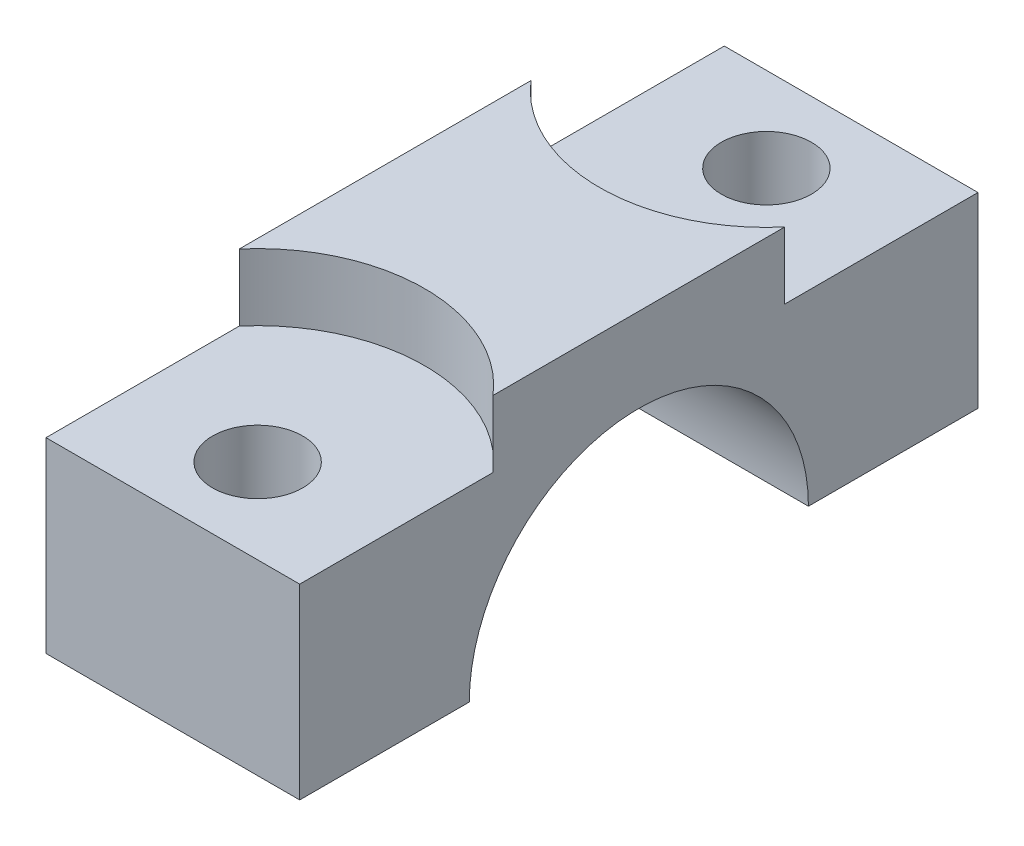
ISO-10303-21;
HEADER;
FILE_DESCRIPTION(('STEP AP214'),'2;1');
FILE_NAME('part.step','',(''),(''),'','','');
FILE_SCHEMA(('AUTOMOTIVE_DESIGN { 1 0 10303 214 1 1 1 1 }'));
ENDSEC;
DATA;
#1=APPLICATION_CONTEXT('core data for automotive mechanical design processes');
#2=APPLICATION_PROTOCOL_DEFINITION('international standard','automotive_design',2000,#1);
#3=PRODUCT_CONTEXT('',#1,'mechanical');
#4=PRODUCT('Part','Part','',(#3));
#5=PRODUCT_RELATED_PRODUCT_CATEGORY('part','',(#4));
#6=PRODUCT_DEFINITION_FORMATION('','',#4);
#7=PRODUCT_DEFINITION_CONTEXT('part definition',#1,'design');
#8=PRODUCT_DEFINITION('design','',#6,#7);
#9=PRODUCT_DEFINITION_SHAPE('','',#8);
#10=(LENGTH_UNIT() NAMED_UNIT(*) SI_UNIT(.MILLI.,.METRE.));
#11=(NAMED_UNIT(*) PLANE_ANGLE_UNIT() SI_UNIT($,.RADIAN.));
#12=(NAMED_UNIT(*) SI_UNIT($,.STERADIAN.) SOLID_ANGLE_UNIT());
#13=UNCERTAINTY_MEASURE_WITH_UNIT(LENGTH_MEASURE(1.E-05),#10,'distance_accuracy_value','');
#14=(GEOMETRIC_REPRESENTATION_CONTEXT(3) GLOBAL_UNCERTAINTY_ASSIGNED_CONTEXT((#13)) GLOBAL_UNIT_ASSIGNED_CONTEXT((#10,
#11,#12)) REPRESENTATION_CONTEXT('',''));
#15=CARTESIAN_POINT('',(0.,0.,0.));
#16=DIRECTION('',(0.,0.,1.));
#17=DIRECTION('',(1.,0.,0.));
#18=AXIS2_PLACEMENT_3D('',#15,#16,#17);
#19=CARTESIAN_POINT('',(9.5,0.,0.));
#20=DIRECTION('',(-1.,0.,0.));
#21=DIRECTION('',(0.,0.,1.));
#22=AXIS2_PLACEMENT_3D('',#19,#20,#21);
#23=CYLINDRICAL_SURFACE('',#22,12.7);
#24=CARTESIAN_POINT('',(-9.5,0.,0.));
#25=DIRECTION('',(1.,0.,0.));
#26=DIRECTION('',(0.,0.,-1.));
#27=AXIS2_PLACEMENT_3D('',#24,#25,#26);
#28=CIRCLE('',#27,12.7);
#29=CARTESIAN_POINT('',(-9.5,0.,-12.7));
#30=VERTEX_POINT('',#29);
#31=CARTESIAN_POINT('',(-9.5,0.,12.7));
#32=VERTEX_POINT('',#31);
#33=EDGE_CURVE('E147',#30,#32,#28,.T.);
#34=ORIENTED_EDGE('',*,*,#33,.F.);
#35=DIRECTION('',(-1.,0.,0.));
#36=VECTOR('',#35,1.);
#37=CARTESIAN_POINT('',(9.5,0.,-12.7));
#38=LINE('',#37,#36);
#39=CARTESIAN_POINT('',(9.5,0.,-12.7));
#40=VERTEX_POINT('',#39);
#41=EDGE_CURVE('E180',#40,#30,#38,.T.);
#42=ORIENTED_EDGE('',*,*,#41,.F.);
#43=CARTESIAN_POINT('',(9.5,0.,0.));
#44=DIRECTION('',(1.,0.,0.));
#45=DIRECTION('',(0.,0.,-1.));
#46=AXIS2_PLACEMENT_3D('',#43,#44,#45);
#47=CIRCLE('',#46,12.7);
#48=CARTESIAN_POINT('',(9.5,0.,12.7));
#49=VERTEX_POINT('',#48);
#50=EDGE_CURVE('E148',#40,#49,#47,.T.);
#51=ORIENTED_EDGE('',*,*,#50,.T.);
#52=DIRECTION('',(-1.,0.,0.));
#53=VECTOR('',#52,1.);
#54=CARTESIAN_POINT('',(9.5,0.,12.7));
#55=LINE('',#54,#53);
#56=EDGE_CURVE('E172',#49,#32,#55,.T.);
#57=ORIENTED_EDGE('',*,*,#56,.T.);
#58=EDGE_LOOP('',(#34,#42,#51,#57));
#59=FACE_BOUND('',#58,.T.);
#60=ADVANCED_FACE('F34',(#59),#23,.F.);
#61=CARTESIAN_POINT('',(9.5,0.,0.));
#62=DIRECTION('',(0.,1.,0.));
#63=DIRECTION('',(0.,0.,1.));
#64=AXIS2_PLACEMENT_3D('',#61,#62,#63);
#65=PLANE('',#64);
#66=CARTESIAN_POINT('',(0.,0.,-19.05));
#67=DIRECTION('',(0.,1.,0.));
#68=DIRECTION('',(0.,0.,1.));
#69=AXIS2_PLACEMENT_3D('',#66,#67,#68);
#70=CIRCLE('',#69,3.37499999999999);
#71=CARTESIAN_POINT('',(0.,0.,-15.675));
#72=VERTEX_POINT('',#71);
#73=EDGE_CURVE('E140',#72,#72,#70,.T.);
#74=ORIENTED_EDGE('',*,*,#73,.T.);
#75=EDGE_LOOP('',(#74));
#76=FACE_BOUND('',#75,.T.);
#77=DIRECTION('',(0.,0.,-1.));
#78=VECTOR('',#77,1.);
#79=CARTESIAN_POINT('',(-9.5,0.,0.));
#80=LINE('',#79,#78);
#81=CARTESIAN_POINT('',(-9.5,0.,-25.4));
#82=VERTEX_POINT('',#81);
#83=EDGE_CURVE('E163',#30,#82,#80,.T.);
#84=ORIENTED_EDGE('',*,*,#83,.T.);
#85=DIRECTION('',(-1.,0.,0.));
#86=VECTOR('',#85,1.);
#87=CARTESIAN_POINT('',(9.5,0.,-25.4));
#88=LINE('',#87,#86);
#89=CARTESIAN_POINT('',(9.5,0.,-25.4));
#90=VERTEX_POINT('',#89);
#91=EDGE_CURVE('E177',#90,#82,#88,.T.);
#92=ORIENTED_EDGE('',*,*,#91,.F.);
#93=DIRECTION('',(0.,0.,-1.));
#94=VECTOR('',#93,1.);
#95=CARTESIAN_POINT('',(9.5,0.,0.));
#96=LINE('',#95,#94);
#97=EDGE_CURVE('E151',#40,#90,#96,.T.);
#98=ORIENTED_EDGE('',*,*,#97,.F.);
#99=ORIENTED_EDGE('',*,*,#41,.T.);
#100=EDGE_LOOP('',(#84,#92,#98,#99));
#101=FACE_BOUND('',#100,.T.);
#102=ADVANCED_FACE('F228',(#76,#101),#65,.F.);
#103=CARTESIAN_POINT('',(9.5,0.,-25.4));
#104=DIRECTION('',(0.,0.,-1.));
#105=DIRECTION('',(0.,1.,0.));
#106=AXIS2_PLACEMENT_3D('',#103,#104,#105);
#107=PLANE('',#106);
#108=DIRECTION('',(-1.,0.,0.));
#109=VECTOR('',#108,1.);
#110=CARTESIAN_POINT('',(9.5,14.,-25.4));
#111=LINE('',#110,#109);
#112=CARTESIAN_POINT('',(9.5,14.,-25.4));
#113=VERTEX_POINT('',#112);
#114=CARTESIAN_POINT('',(-9.5,14.,-25.4));
#115=VERTEX_POINT('',#114);
#116=EDGE_CURVE('E145',#113,#115,#111,.T.);
#117=ORIENTED_EDGE('',*,*,#116,.F.);
#118=DIRECTION('',(0.,-1.,0.));
#119=VECTOR('',#118,1.);
#120=CARTESIAN_POINT('',(9.5,0.,-25.4));
#121=LINE('',#120,#119);
#122=EDGE_CURVE('E155',#113,#90,#121,.T.);
#123=ORIENTED_EDGE('',*,*,#122,.T.);
#124=ORIENTED_EDGE('',*,*,#91,.T.);
#125=DIRECTION('',(0.,-1.,0.));
#126=VECTOR('',#125,1.);
#127=CARTESIAN_POINT('',(-9.5,0.,-25.4));
#128=LINE('',#127,#126);
#129=EDGE_CURVE('E166',#115,#82,#128,.T.);
#130=ORIENTED_EDGE('',*,*,#129,.F.);
#131=EDGE_LOOP('',(#117,#123,#124,#130));
#132=FACE_BOUND('',#131,.T.);
#133=ADVANCED_FACE('F215',(#132),#107,.T.);
#134=CARTESIAN_POINT('',(9.5,19.,0.));
#135=DIRECTION('',(0.,1.,0.));
#136=DIRECTION('',(0.,0.,1.));
#137=AXIS2_PLACEMENT_3D('',#134,#135,#136);
#138=PLANE('',#137);
#139=CARTESIAN_POINT('',(0.,19.,19.05));
#140=DIRECTION('',(0.,1.,0.));
#141=DIRECTION('',(0.,0.,1.));
#142=AXIS2_PLACEMENT_3D('',#139,#140,#141);
#143=CIRCLE('',#142,12.5);
#144=CARTESIAN_POINT('',(9.5,19.,10.925961595364));
#145=VERTEX_POINT('',#144);
#146=CARTESIAN_POINT('',(-9.5,19.,10.925961595364));
#147=VERTEX_POINT('',#146);
#148=EDGE_CURVE('E124',#145,#147,#143,.T.);
#149=ORIENTED_EDGE('',*,*,#148,.F.);
#150=DIRECTION('',(0.,0.,-1.));
#151=VECTOR('',#150,1.);
#152=CARTESIAN_POINT('',(9.5,19.,0.));
#153=LINE('',#152,#151);
#154=CARTESIAN_POINT('',(9.5,19.,-10.925961595364));
#155=VERTEX_POINT('',#154);
#156=EDGE_CURVE('E129',#145,#155,#153,.T.);
#157=ORIENTED_EDGE('',*,*,#156,.T.);
#158=CARTESIAN_POINT('',(0.,19.,-19.05));
#159=DIRECTION('',(0.,1.,0.));
#160=DIRECTION('',(0.,0.,1.));
#161=AXIS2_PLACEMENT_3D('',#158,#159,#160);
#162=CIRCLE('',#161,12.5);
#163=CARTESIAN_POINT('',(-9.5,19.,-10.925961595364));
#164=VERTEX_POINT('',#163);
#165=EDGE_CURVE('E130',#164,#155,#162,.T.);
#166=ORIENTED_EDGE('',*,*,#165,.F.);
#167=DIRECTION('',(0.,0.,-1.));
#168=VECTOR('',#167,1.);
#169=CARTESIAN_POINT('',(-9.5,19.,0.));
#170=LINE('',#169,#168);
#171=EDGE_CURVE('E168',#147,#164,#170,.T.);
#172=ORIENTED_EDGE('',*,*,#171,.F.);
#173=EDGE_LOOP('',(#149,#157,#166,#172));
#174=FACE_BOUND('',#173,.T.);
#175=ADVANCED_FACE('F204',(#174),#138,.T.);
#176=CARTESIAN_POINT('',(9.5,0.,25.4));
#177=DIRECTION('',(0.,0.,-1.));
#178=DIRECTION('',(-1.,0.,0.));
#179=AXIS2_PLACEMENT_3D('',#176,#177,#178);
#180=PLANE('',#179);
#181=DIRECTION('',(0.,-1.,0.));
#182=VECTOR('',#181,1.);
#183=CARTESIAN_POINT('',(9.5,0.,25.4));
#184=LINE('',#183,#182);
#185=CARTESIAN_POINT('',(9.5,14.,25.4));
#186=VERTEX_POINT('',#185);
#187=CARTESIAN_POINT('',(9.5,0.,25.4));
#188=VERTEX_POINT('',#187);
#189=EDGE_CURVE('E159',#186,#188,#184,.T.);
#190=ORIENTED_EDGE('',*,*,#189,.F.);
#191=DIRECTION('',(-1.,0.,0.));
#192=VECTOR('',#191,1.);
#193=CARTESIAN_POINT('',(9.5,14.,25.4));
#194=LINE('',#193,#192);
#195=CARTESIAN_POINT('',(-9.5,14.,25.4));
#196=VERTEX_POINT('',#195);
#197=EDGE_CURVE('E113',#186,#196,#194,.T.);
#198=ORIENTED_EDGE('',*,*,#197,.T.);
#199=DIRECTION('',(0.,-1.,0.));
#200=VECTOR('',#199,1.);
#201=CARTESIAN_POINT('',(-9.5,0.,25.4));
#202=LINE('',#201,#200);
#203=CARTESIAN_POINT('',(-9.5,0.,25.4));
#204=VERTEX_POINT('',#203);
#205=EDGE_CURVE('E170',#196,#204,#202,.T.);
#206=ORIENTED_EDGE('',*,*,#205,.T.);
#207=DIRECTION('',(-1.,0.,0.));
#208=VECTOR('',#207,1.);
#209=CARTESIAN_POINT('',(9.5,0.,25.4));
#210=LINE('',#209,#208);
#211=EDGE_CURVE('E174',#188,#204,#210,.T.);
#212=ORIENTED_EDGE('',*,*,#211,.F.);
#213=EDGE_LOOP('',(#190,#198,#206,#212));
#214=FACE_BOUND('',#213,.T.);
#215=ADVANCED_FACE('F195',(#214),#180,.F.);
#216=CARTESIAN_POINT('',(0.,0.,19.05));
#217=DIRECTION('',(0.,1.,0.));
#218=DIRECTION('',(0.,0.,1.));
#219=AXIS2_PLACEMENT_3D('',#216,#217,#218);
#220=CIRCLE('',#219,3.37499999999999);
#221=CARTESIAN_POINT('',(0.,0.,22.425));
#222=VERTEX_POINT('',#221);
#223=EDGE_CURVE('E197',#222,#222,#220,.T.);
#224=ORIENTED_EDGE('',*,*,#223,.T.);
#225=EDGE_LOOP('',(#224));
#226=FACE_BOUND('',#225,.T.);
#227=EDGE_CURVE('E152',#204,#32,#80,.T.);
#228=ORIENTED_EDGE('',*,*,#227,.T.);
#229=ORIENTED_EDGE('',*,*,#56,.F.);
#230=EDGE_CURVE('E156',#188,#49,#96,.T.);
#231=ORIENTED_EDGE('',*,*,#230,.F.);
#232=ORIENTED_EDGE('',*,*,#211,.T.);
#233=EDGE_LOOP('',(#228,#229,#231,#232));
#234=FACE_BOUND('',#233,.T.);
#235=ADVANCED_FACE('F227',(#226,#234),#65,.F.);
#236=CARTESIAN_POINT('',(9.5,0.,0.));
#237=DIRECTION('',(1.,0.,0.));
#238=DIRECTION('',(0.,0.,-1.));
#239=AXIS2_PLACEMENT_3D('',#236,#237,#238);
#240=PLANE('',#239);
#241=DIRECTION('',(0.,1.,0.));
#242=VECTOR('',#241,1.);
#243=CARTESIAN_POINT('',(9.5,19.,10.925961595364));
#244=LINE('',#243,#242);
#245=CARTESIAN_POINT('',(9.5,14.,10.925961595364));
#246=VERTEX_POINT('',#245);
#247=EDGE_CURVE('E117',#246,#145,#244,.T.);
#248=ORIENTED_EDGE('',*,*,#247,.F.);
#249=DIRECTION('',(0.,0.,-1.));
#250=VECTOR('',#249,1.);
#251=CARTESIAN_POINT('',(9.5,14.,0.));
#252=LINE('',#251,#250);
#253=EDGE_CURVE('E109',#186,#246,#252,.T.);
#254=ORIENTED_EDGE('',*,*,#253,.F.);
#255=ORIENTED_EDGE('',*,*,#189,.T.);
#256=ORIENTED_EDGE('',*,*,#230,.T.);
#257=ORIENTED_EDGE('',*,*,#50,.F.);
#258=ORIENTED_EDGE('',*,*,#97,.T.);
#259=ORIENTED_EDGE('',*,*,#122,.F.);
#260=DIRECTION('',(0.,0.,-1.));
#261=VECTOR('',#260,1.);
#262=CARTESIAN_POINT('',(9.5,14.,0.));
#263=LINE('',#262,#261);
#264=CARTESIAN_POINT('',(9.5,14.,-10.925961595364));
#265=VERTEX_POINT('',#264);
#266=EDGE_CURVE('E188',#265,#113,#263,.T.);
#267=ORIENTED_EDGE('',*,*,#266,.F.);
#268=DIRECTION('',(0.,1.,0.));
#269=VECTOR('',#268,1.);
#270=CARTESIAN_POINT('',(9.5,19.,-10.925961595364));
#271=LINE('',#270,#269);
#272=EDGE_CURVE('E143',#155,#265,#271,.F.);
#273=ORIENTED_EDGE('',*,*,#272,.F.);
#274=ORIENTED_EDGE('',*,*,#156,.F.);
#275=EDGE_LOOP('',(#248,#254,#255,#256,#257,#258,#259,#267,#273,#274));
#276=FACE_BOUND('',#275,.T.);
#277=ADVANCED_FACE('F127',(#276),#240,.T.);
#278=CARTESIAN_POINT('',(-9.5,0.,0.));
#279=DIRECTION('',(1.,0.,0.));
#280=DIRECTION('',(0.,0.,-1.));
#281=AXIS2_PLACEMENT_3D('',#278,#279,#280);
#282=PLANE('',#281);
#283=DIRECTION('',(0.,0.,-1.));
#284=VECTOR('',#283,1.);
#285=CARTESIAN_POINT('',(-9.5,14.,0.));
#286=LINE('',#285,#284);
#287=CARTESIAN_POINT('',(-9.5,14.,10.925961595364));
#288=VERTEX_POINT('',#287);
#289=EDGE_CURVE('E41',#196,#288,#286,.T.);
#290=ORIENTED_EDGE('',*,*,#289,.T.);
#291=DIRECTION('',(0.,1.,0.));
#292=VECTOR('',#291,1.);
#293=CARTESIAN_POINT('',(-9.5,19.,10.925961595364));
#294=LINE('',#293,#292);
#295=EDGE_CURVE('E11',#288,#147,#294,.T.);
#296=ORIENTED_EDGE('',*,*,#295,.T.);
#297=ORIENTED_EDGE('',*,*,#171,.T.);
#298=DIRECTION('',(0.,1.,0.));
#299=VECTOR('',#298,1.);
#300=CARTESIAN_POINT('',(-9.5,19.,-10.925961595364));
#301=LINE('',#300,#299);
#302=CARTESIAN_POINT('',(-9.5,14.,-10.925961595364));
#303=VERTEX_POINT('',#302);
#304=EDGE_CURVE('E182',#164,#303,#301,.F.);
#305=ORIENTED_EDGE('',*,*,#304,.T.);
#306=DIRECTION('',(0.,0.,-1.));
#307=VECTOR('',#306,1.);
#308=CARTESIAN_POINT('',(-9.5,14.,0.));
#309=LINE('',#308,#307);
#310=EDGE_CURVE('E185',#303,#115,#309,.T.);
#311=ORIENTED_EDGE('',*,*,#310,.T.);
#312=ORIENTED_EDGE('',*,*,#129,.T.);
#313=ORIENTED_EDGE('',*,*,#83,.F.);
#314=ORIENTED_EDGE('',*,*,#33,.T.);
#315=ORIENTED_EDGE('',*,*,#227,.F.);
#316=ORIENTED_EDGE('',*,*,#205,.F.);
#317=EDGE_LOOP('',(#290,#296,#297,#305,#311,#312,#313,#314,#315,#316));
#318=FACE_BOUND('',#317,.T.);
#319=ADVANCED_FACE('F191',(#318),#282,.F.);
#320=CARTESIAN_POINT('',(0.,19.,-19.05));
#321=DIRECTION('',(0.,1.,0.));
#322=DIRECTION('',(0.,0.,1.));
#323=AXIS2_PLACEMENT_3D('',#320,#321,#322);
#324=CYLINDRICAL_SURFACE('',#323,3.375);
#325=ORIENTED_EDGE('',*,*,#73,.F.);
#326=EDGE_LOOP('',(#325));
#327=FACE_BOUND('',#326,.T.);
#328=CARTESIAN_POINT('',(0.,14.,-19.05));
#329=DIRECTION('',(0.,1.,0.));
#330=DIRECTION('',(0.,0.,1.));
#331=AXIS2_PLACEMENT_3D('',#328,#329,#330);
#332=CIRCLE('',#331,3.375);
#333=CARTESIAN_POINT('',(0.,14.,-15.675));
#334=VERTEX_POINT('',#333);
#335=EDGE_CURVE('E137',#334,#334,#332,.T.);
#336=ORIENTED_EDGE('',*,*,#335,.T.);
#337=EDGE_LOOP('',(#336));
#338=FACE_BOUND('',#337,.T.);
#339=ADVANCED_FACE('F263',(#327,#338),#324,.F.);
#340=CARTESIAN_POINT('',(3.375,14.,-19.05));
#341=DIRECTION('',(0.,-1.,0.));
#342=DIRECTION('',(0.,0.,-1.));
#343=AXIS2_PLACEMENT_3D('',#340,#341,#342);
#344=PLANE('',#343);
#345=ORIENTED_EDGE('',*,*,#266,.T.);
#346=ORIENTED_EDGE('',*,*,#116,.T.);
#347=ORIENTED_EDGE('',*,*,#310,.F.);
#348=CARTESIAN_POINT('',(0.,14.,-19.05));
#349=DIRECTION('',(0.,1.,0.));
#350=DIRECTION('',(0.,0.,1.));
#351=AXIS2_PLACEMENT_3D('',#348,#349,#350);
#352=CIRCLE('',#351,12.5);
#353=EDGE_CURVE('E56',#303,#265,#352,.T.);
#354=ORIENTED_EDGE('',*,*,#353,.T.);
#355=EDGE_LOOP('',(#345,#346,#347,#354));
#356=FACE_BOUND('',#355,.T.);
#357=ORIENTED_EDGE('',*,*,#335,.F.);
#358=EDGE_LOOP('',(#357));
#359=FACE_BOUND('',#358,.T.);
#360=ADVANCED_FACE('F211',(#356,#359),#344,.F.);
#361=CARTESIAN_POINT('',(0.,19.,-19.05));
#362=DIRECTION('',(0.,1.,0.));
#363=DIRECTION('',(0.,0.,1.));
#364=AXIS2_PLACEMENT_3D('',#361,#362,#363);
#365=CYLINDRICAL_SURFACE('',#364,12.5);
#366=ORIENTED_EDGE('',*,*,#272,.T.);
#367=ORIENTED_EDGE('',*,*,#353,.F.);
#368=ORIENTED_EDGE('',*,*,#304,.F.);
#369=ORIENTED_EDGE('',*,*,#165,.T.);
#370=EDGE_LOOP('',(#366,#367,#368,#369));
#371=FACE_BOUND('',#370,.T.);
#372=ADVANCED_FACE('F206',(#371),#365,.F.);
#373=CARTESIAN_POINT('',(0.,19.,19.05));
#374=DIRECTION('',(0.,1.,0.));
#375=DIRECTION('',(0.,0.,1.));
#376=AXIS2_PLACEMENT_3D('',#373,#374,#375);
#377=CYLINDRICAL_SURFACE('',#376,3.375);
#378=ORIENTED_EDGE('',*,*,#223,.F.);
#379=EDGE_LOOP('',(#378));
#380=FACE_BOUND('',#379,.T.);
#381=CARTESIAN_POINT('',(0.,14.,19.05));
#382=DIRECTION('',(0.,1.,0.));
#383=DIRECTION('',(0.,0.,1.));
#384=AXIS2_PLACEMENT_3D('',#381,#382,#383);
#385=CIRCLE('',#384,3.375);
#386=CARTESIAN_POINT('',(0.,14.,22.425));
#387=VERTEX_POINT('',#386);
#388=EDGE_CURVE('E123',#387,#387,#385,.T.);
#389=ORIENTED_EDGE('',*,*,#388,.T.);
#390=EDGE_LOOP('',(#389));
#391=FACE_BOUND('',#390,.T.);
#392=ADVANCED_FACE('F247',(#380,#391),#377,.F.);
#393=CARTESIAN_POINT('',(3.375,14.,19.05));
#394=DIRECTION('',(0.,-1.,0.));
#395=DIRECTION('',(0.,0.,-1.));
#396=AXIS2_PLACEMENT_3D('',#393,#394,#395);
#397=PLANE('',#396);
#398=ORIENTED_EDGE('',*,*,#253,.T.);
#399=CARTESIAN_POINT('',(0.,14.,19.05));
#400=DIRECTION('',(0.,1.,0.));
#401=DIRECTION('',(0.,0.,1.));
#402=AXIS2_PLACEMENT_3D('',#399,#400,#401);
#403=CIRCLE('',#402,12.5);
#404=EDGE_CURVE('E48',#246,#288,#403,.T.);
#405=ORIENTED_EDGE('',*,*,#404,.T.);
#406=ORIENTED_EDGE('',*,*,#289,.F.);
#407=ORIENTED_EDGE('',*,*,#197,.F.);
#408=EDGE_LOOP('',(#398,#405,#406,#407));
#409=FACE_BOUND('',#408,.T.);
#410=ORIENTED_EDGE('',*,*,#388,.F.);
#411=EDGE_LOOP('',(#410));
#412=FACE_BOUND('',#411,.T.);
#413=ADVANCED_FACE('F110',(#409,#412),#397,.F.);
#414=CARTESIAN_POINT('',(0.,19.,19.05));
#415=DIRECTION('',(0.,1.,0.));
#416=DIRECTION('',(0.,0.,1.));
#417=AXIS2_PLACEMENT_3D('',#414,#415,#416);
#418=CYLINDRICAL_SURFACE('',#417,12.5);
#419=ORIENTED_EDGE('',*,*,#247,.T.);
#420=ORIENTED_EDGE('',*,*,#148,.T.);
#421=ORIENTED_EDGE('',*,*,#295,.F.);
#422=ORIENTED_EDGE('',*,*,#404,.F.);
#423=EDGE_LOOP('',(#419,#420,#421,#422));
#424=FACE_BOUND('',#423,.T.);
#425=ADVANCED_FACE('F120',(#424),#418,.F.);
#426=CLOSED_SHELL('',(#60,#102,#133,#175,#215,#235,#277,#319,#339,#360,#372,#392,#413,#425));
#427=MANIFOLD_SOLID_BREP('B2',#426);
#428=ADVANCED_BREP_SHAPE_REPRESENTATION('',(#18,#427),#14);
#429=SHAPE_DEFINITION_REPRESENTATION(#9,#428);
ENDSEC;
END-ISO-10303-21;
